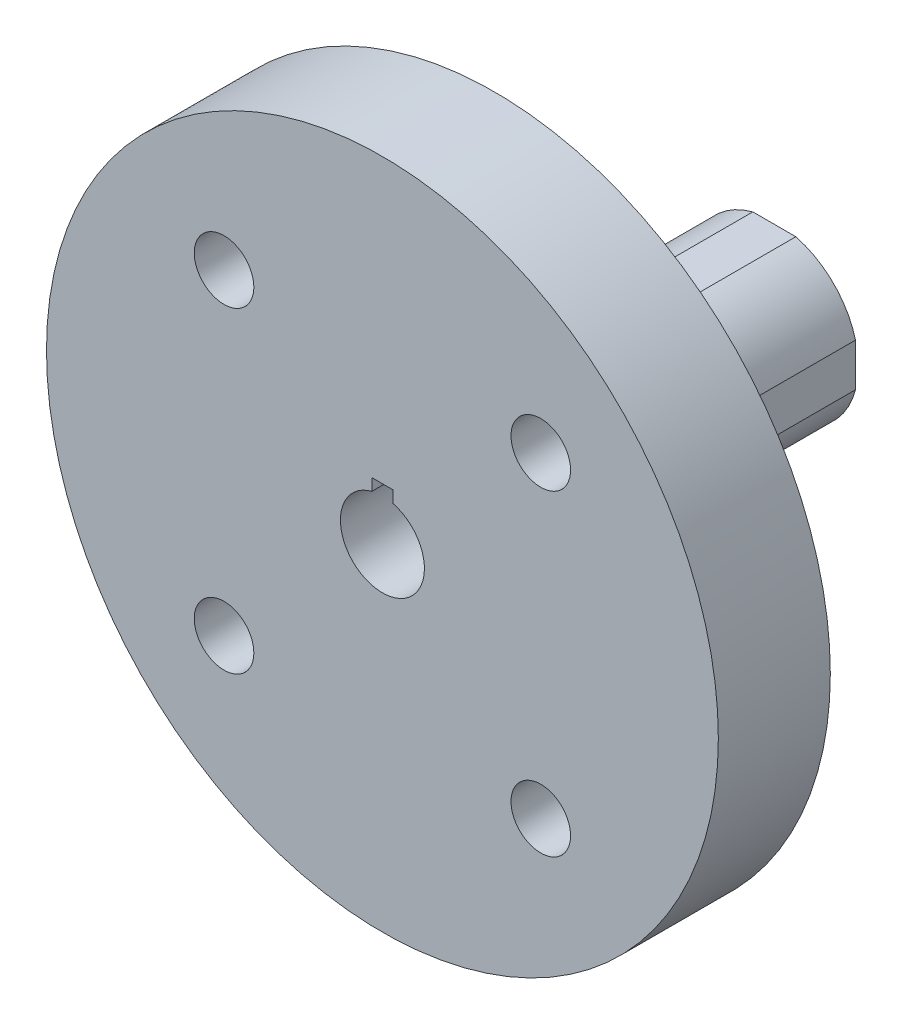
ISO-10303-21;
HEADER;
FILE_DESCRIPTION(('STEP AP214'),'2;1');
FILE_NAME('part.step','',(''),(''),'','','');
FILE_SCHEMA(('AUTOMOTIVE_DESIGN { 1 0 10303 214 1 1 1 1 }'));
ENDSEC;
DATA;
#1=APPLICATION_CONTEXT('core data for automotive mechanical design processes');
#2=APPLICATION_PROTOCOL_DEFINITION('international standard','automotive_design',2000,#1);
#3=PRODUCT_CONTEXT('',#1,'mechanical');
#4=PRODUCT('Part','Part','',(#3));
#5=PRODUCT_RELATED_PRODUCT_CATEGORY('part','',(#4));
#6=PRODUCT_DEFINITION_FORMATION('','',#4);
#7=PRODUCT_DEFINITION_CONTEXT('part definition',#1,'design');
#8=PRODUCT_DEFINITION('design','',#6,#7);
#9=PRODUCT_DEFINITION_SHAPE('','',#8);
#10=(LENGTH_UNIT() NAMED_UNIT(*) SI_UNIT(.MILLI.,.METRE.));
#11=(NAMED_UNIT(*) PLANE_ANGLE_UNIT() SI_UNIT($,.RADIAN.));
#12=(NAMED_UNIT(*) SI_UNIT($,.STERADIAN.) SOLID_ANGLE_UNIT());
#13=UNCERTAINTY_MEASURE_WITH_UNIT(LENGTH_MEASURE(1.E-05),#10,'distance_accuracy_value','');
#14=(GEOMETRIC_REPRESENTATION_CONTEXT(3) GLOBAL_UNCERTAINTY_ASSIGNED_CONTEXT((#13)) GLOBAL_UNIT_ASSIGNED_CONTEXT((#10,
#11,#12)) REPRESENTATION_CONTEXT('',''));
#15=CARTESIAN_POINT('',(0.,0.,0.));
#16=DIRECTION('',(0.,0.,1.));
#17=DIRECTION('',(1.,0.,0.));
#18=AXIS2_PLACEMENT_3D('',#15,#16,#17);
#19=CARTESIAN_POINT('',(0.,0.,0.));
#20=DIRECTION('',(0.,0.,1.));
#21=DIRECTION('',(1.,0.,0.));
#22=AXIS2_PLACEMENT_3D('',#19,#20,#21);
#23=PLANE('',#22);
#24=CARTESIAN_POINT('',(35.9210244842767,-35.9210244842765,0.));
#25=DIRECTION('',(0.,0.,1.));
#26=DIRECTION('',(1.,0.,0.));
#27=AXIS2_PLACEMENT_3D('',#24,#25,#26);
#28=CIRCLE('',#27,6.7564);
#29=CARTESIAN_POINT('',(42.6774244842767,-35.9210244842765,0.));
#30=VERTEX_POINT('',#29);
#31=EDGE_CURVE('E201',#30,#30,#28,.T.);
#32=ORIENTED_EDGE('',*,*,#31,.T.);
#33=EDGE_LOOP('',(#32));
#34=FACE_BOUND('',#33,.T.);
#35=CARTESIAN_POINT('',(-35.9210244842766,35.9210244842767,0.));
#36=DIRECTION('',(0.,0.,1.));
#37=DIRECTION('',(1.,0.,0.));
#38=AXIS2_PLACEMENT_3D('',#35,#36,#37);
#39=CIRCLE('',#38,6.7564);
#40=CARTESIAN_POINT('',(-29.1646244842766,35.9210244842767,0.));
#41=VERTEX_POINT('',#40);
#42=EDGE_CURVE('E463',#41,#41,#39,.T.);
#43=ORIENTED_EDGE('',*,*,#42,.T.);
#44=EDGE_LOOP('',(#43));
#45=FACE_BOUND('',#44,.T.);
#46=CARTESIAN_POINT('',(-35.9210244842767,-35.9210244842766,0.));
#47=DIRECTION('',(0.,0.,1.));
#48=DIRECTION('',(1.,0.,0.));
#49=AXIS2_PLACEMENT_3D('',#46,#47,#48);
#50=CIRCLE('',#49,6.7564);
#51=CARTESIAN_POINT('',(-29.1646244842767,-35.9210244842766,0.));
#52=VERTEX_POINT('',#51);
#53=EDGE_CURVE('E461',#52,#52,#50,.T.);
#54=ORIENTED_EDGE('',*,*,#53,.T.);
#55=EDGE_LOOP('',(#54));
#56=FACE_BOUND('',#55,.T.);
#57=CARTESIAN_POINT('',(35.9210244842765,35.9210244842767,0.));
#58=DIRECTION('',(0.,0.,1.));
#59=DIRECTION('',(1.,0.,0.));
#60=AXIS2_PLACEMENT_3D('',#57,#58,#59);
#61=CIRCLE('',#60,6.7564);
#62=CARTESIAN_POINT('',(42.6774244842765,35.9210244842767,0.));
#63=VERTEX_POINT('',#62);
#64=EDGE_CURVE('E464',#63,#63,#61,.T.);
#65=ORIENTED_EDGE('',*,*,#64,.T.);
#66=EDGE_LOOP('',(#65));
#67=FACE_BOUND('',#66,.T.);
#68=CARTESIAN_POINT('',(0.,0.,0.));
#69=DIRECTION('',(0.,0.,1.));
#70=DIRECTION('',(1.,0.,0.));
#71=AXIS2_PLACEMENT_3D('',#68,#69,#70);
#72=CIRCLE('',#71,76.2);
#73=CARTESIAN_POINT('',(76.2,0.,0.));
#74=VERTEX_POINT('',#73);
#75=EDGE_CURVE('E50',#74,#74,#72,.T.);
#76=ORIENTED_EDGE('',*,*,#75,.F.);
#77=EDGE_LOOP('',(#76));
#78=FACE_BOUND('',#77,.T.);
#79=DIRECTION('',(-1.,0.,0.));
#80=VECTOR('',#79,1.);
#81=CARTESIAN_POINT('',(50.165,-4.8775275498966,0.));
#82=LINE('',#81,#80);
#83=CARTESIAN_POINT('',(50.165,-4.8775275498966,0.));
#84=VERTEX_POINT('',#83);
#85=CARTESIAN_POINT('',(18.415,-4.8775275498966,0.));
#86=VERTEX_POINT('',#85);
#87=EDGE_CURVE('E197',#84,#86,#82,.T.);
#88=ORIENTED_EDGE('',*,*,#87,.F.);
#89=DIRECTION('',(0.,-1.,0.));
#90=VECTOR('',#89,1.);
#91=CARTESIAN_POINT('',(50.165,4.87752754989659,0.));
#92=LINE('',#91,#90);
#93=CARTESIAN_POINT('',(50.165,4.87752754989662,0.));
#94=VERTEX_POINT('',#93);
#95=EDGE_CURVE('E184',#94,#84,#92,.T.);
#96=ORIENTED_EDGE('',*,*,#95,.F.);
#97=DIRECTION('',(1.,0.,0.));
#98=VECTOR('',#97,1.);
#99=CARTESIAN_POINT('',(18.415,4.8775275498966,0.));
#100=LINE('',#99,#98);
#101=CARTESIAN_POINT('',(18.415,4.8775275498966,0.));
#102=VERTEX_POINT('',#101);
#103=EDGE_CURVE('E193',#102,#94,#100,.T.);
#104=ORIENTED_EDGE('',*,*,#103,.F.);
#105=CARTESIAN_POINT('',(0.,0.,0.));
#106=DIRECTION('',(0.,0.,-1.));
#107=DIRECTION('',(-1.,0.,0.));
#108=AXIS2_PLACEMENT_3D('',#105,#106,#107);
#109=CIRCLE('',#108,19.05);
#110=CARTESIAN_POINT('',(4.87752754989658,18.415,0.));
#111=VERTEX_POINT('',#110);
#112=EDGE_CURVE('E55',#111,#102,#109,.T.);
#113=ORIENTED_EDGE('',*,*,#112,.F.);
#114=DIRECTION('',(0.,-1.,0.));
#115=VECTOR('',#114,1.);
#116=CARTESIAN_POINT('',(4.87752754989658,18.415,0.));
#117=LINE('',#116,#115);
#118=CARTESIAN_POINT('',(4.87752754989658,50.165,0.));
#119=VERTEX_POINT('',#118);
#120=EDGE_CURVE('E281',#119,#111,#117,.T.);
#121=ORIENTED_EDGE('',*,*,#120,.F.);
#122=DIRECTION('',(1.,0.,0.));
#123=VECTOR('',#122,1.);
#124=CARTESIAN_POINT('',(-4.87752754989658,50.165,0.));
#125=LINE('',#124,#123);
#126=CARTESIAN_POINT('',(-4.87752754989658,50.165,0.));
#127=VERTEX_POINT('',#126);
#128=EDGE_CURVE('E284',#127,#119,#125,.T.);
#129=ORIENTED_EDGE('',*,*,#128,.F.);
#130=DIRECTION('',(0.,1.,0.));
#131=VECTOR('',#130,1.);
#132=CARTESIAN_POINT('',(-4.87752754989658,18.415,0.));
#133=LINE('',#132,#131);
#134=CARTESIAN_POINT('',(-4.87752754989658,18.415,0.));
#135=VERTEX_POINT('',#134);
#136=EDGE_CURVE('E277',#135,#127,#133,.T.);
#137=ORIENTED_EDGE('',*,*,#136,.F.);
#138=CARTESIAN_POINT('',(-18.415,4.87752754989656,0.));
#139=VERTEX_POINT('',#138);
#140=EDGE_CURVE('E11',#139,#135,#109,.T.);
#141=ORIENTED_EDGE('',*,*,#140,.F.);
#142=DIRECTION('',(1.,0.,0.));
#143=VECTOR('',#142,1.);
#144=CARTESIAN_POINT('',(-18.415,4.87752754989656,0.));
#145=LINE('',#144,#143);
#146=CARTESIAN_POINT('',(-50.165,4.87752754989656,0.));
#147=VERTEX_POINT('',#146);
#148=EDGE_CURVE('E220',#147,#139,#145,.T.);
#149=ORIENTED_EDGE('',*,*,#148,.F.);
#150=DIRECTION('',(0.,1.,0.));
#151=VECTOR('',#150,1.);
#152=CARTESIAN_POINT('',(-50.165,4.87752754989656,0.));
#153=LINE('',#152,#151);
#154=CARTESIAN_POINT('',(-50.165,-4.87752754989657,0.));
#155=VERTEX_POINT('',#154);
#156=EDGE_CURVE('E223',#155,#147,#153,.T.);
#157=ORIENTED_EDGE('',*,*,#156,.F.);
#158=DIRECTION('',(-1.,0.,0.));
#159=VECTOR('',#158,1.);
#160=CARTESIAN_POINT('',(-50.165,-4.87752754989656,0.));
#161=LINE('',#160,#159);
#162=CARTESIAN_POINT('',(-18.415,-4.87752754989656,0.));
#163=VERTEX_POINT('',#162);
#164=EDGE_CURVE('E216',#163,#155,#161,.T.);
#165=ORIENTED_EDGE('',*,*,#164,.F.);
#166=CARTESIAN_POINT('',(-4.8775275498954,-18.4150000000003,0.));
#167=VERTEX_POINT('',#166);
#168=EDGE_CURVE('E57',#167,#163,#109,.T.);
#169=ORIENTED_EDGE('',*,*,#168,.F.);
#170=DIRECTION('',(0.,1.,0.));
#171=VECTOR('',#170,1.);
#172=CARTESIAN_POINT('',(-4.8775275498954,-50.1650000000003,0.));
#173=LINE('',#172,#171);
#174=CARTESIAN_POINT('',(-4.8775275498954,-50.1650000000003,0.));
#175=VERTEX_POINT('',#174);
#176=EDGE_CURVE('E231',#175,#167,#173,.T.);
#177=ORIENTED_EDGE('',*,*,#176,.F.);
#178=DIRECTION('',(-1.,0.,0.));
#179=VECTOR('',#178,1.);
#180=CARTESIAN_POINT('',(4.8775275498954,-50.1650000000003,0.));
#181=LINE('',#180,#179);
#182=CARTESIAN_POINT('',(4.8775275498954,-50.1650000000003,0.));
#183=VERTEX_POINT('',#182);
#184=EDGE_CURVE('E235',#183,#175,#181,.T.);
#185=ORIENTED_EDGE('',*,*,#184,.F.);
#186=DIRECTION('',(0.,-1.,0.));
#187=VECTOR('',#186,1.);
#188=CARTESIAN_POINT('',(4.8775275498954,-18.4150000000003,0.));
#189=LINE('',#188,#187);
#190=CARTESIAN_POINT('',(4.8775275498954,-18.4150000000003,0.));
#191=VERTEX_POINT('',#190);
#192=EDGE_CURVE('E237',#191,#183,#189,.T.);
#193=ORIENTED_EDGE('',*,*,#192,.F.);
#194=EDGE_CURVE('E206',#86,#191,#109,.T.);
#195=ORIENTED_EDGE('',*,*,#194,.F.);
#196=EDGE_LOOP('',(#88,#96,#104,#113,#121,#129,#137,#141,#149,#157,#165,#169,#177,#185,#193,#195));
#197=FACE_BOUND('',#196,.T.);
#198=ADVANCED_FACE('F46',(#34,#45,#56,#67,#78,#197),#23,.F.);
#199=CARTESIAN_POINT('',(-18.415,4.87752754989656,0.));
#200=DIRECTION('',(1.,0.,0.));
#201=DIRECTION('',(0.,0.,-1.));
#202=AXIS2_PLACEMENT_3D('',#199,#200,#201);
#203=PLANE('',#202);
#204=DIRECTION('',(0.,-1.,0.));
#205=VECTOR('',#204,1.);
#206=CARTESIAN_POINT('',(-18.415,-4.87752754989656,-31.75));
#207=LINE('',#206,#205);
#208=CARTESIAN_POINT('',(-18.415,4.87752754989656,-31.75));
#209=VERTEX_POINT('',#208);
#210=CARTESIAN_POINT('',(-18.415,-4.87752754989657,-31.75));
#211=VERTEX_POINT('',#210);
#212=EDGE_CURVE('E217',#209,#211,#207,.T.);
#213=ORIENTED_EDGE('',*,*,#212,.F.);
#214=DIRECTION('',(0.,0.,-1.));
#215=VECTOR('',#214,1.);
#216=CARTESIAN_POINT('',(-18.415,4.87752754989656,0.));
#217=LINE('',#216,#215);
#218=CARTESIAN_POINT('',(-18.415,4.87752754989656,-63.5));
#219=VERTEX_POINT('',#218);
#220=EDGE_CURVE('E324',#209,#219,#217,.T.);
#221=ORIENTED_EDGE('',*,*,#220,.T.);
#222=DIRECTION('',(0.,-1.,0.));
#223=VECTOR('',#222,1.);
#224=CARTESIAN_POINT('',(-18.415,4.87752754989656,-63.5));
#225=LINE('',#224,#223);
#226=CARTESIAN_POINT('',(-18.415,-4.87752754989656,-63.5));
#227=VERTEX_POINT('',#226);
#228=EDGE_CURVE('E323',#219,#227,#225,.T.);
#229=ORIENTED_EDGE('',*,*,#228,.T.);
#230=DIRECTION('',(0.,0.,-1.));
#231=VECTOR('',#230,1.);
#232=CARTESIAN_POINT('',(-18.415,-4.87752754989656,0.));
#233=LINE('',#232,#231);
#234=EDGE_CURVE('E280',#211,#227,#233,.T.);
#235=ORIENTED_EDGE('',*,*,#234,.F.);
#236=EDGE_LOOP('',(#213,#221,#229,#235));
#237=FACE_BOUND('',#236,.T.);
#238=ADVANCED_FACE('F343',(#237),#203,.F.);
#239=CARTESIAN_POINT('',(4.87752754989658,18.415,0.));
#240=DIRECTION('',(0.,-1.,0.));
#241=DIRECTION('',(0.,0.,-1.));
#242=AXIS2_PLACEMENT_3D('',#239,#240,#241);
#243=PLANE('',#242);
#244=DIRECTION('',(-1.,0.,0.));
#245=VECTOR('',#244,1.);
#246=CARTESIAN_POINT('',(-4.87752754989658,18.415,-31.75));
#247=LINE('',#246,#245);
#248=CARTESIAN_POINT('',(4.87752754989658,18.415,-31.75));
#249=VERTEX_POINT('',#248);
#250=CARTESIAN_POINT('',(-4.87752754989658,18.415,-31.75));
#251=VERTEX_POINT('',#250);
#252=EDGE_CURVE('E278',#249,#251,#247,.T.);
#253=ORIENTED_EDGE('',*,*,#252,.F.);
#254=DIRECTION('',(0.,0.,-1.));
#255=VECTOR('',#254,1.);
#256=CARTESIAN_POINT('',(4.87752754989658,18.415,0.));
#257=LINE('',#256,#255);
#258=CARTESIAN_POINT('',(4.87752754989658,18.415,-63.5));
#259=VERTEX_POINT('',#258);
#260=EDGE_CURVE('E291',#249,#259,#257,.T.);
#261=ORIENTED_EDGE('',*,*,#260,.T.);
#262=DIRECTION('',(-1.,0.,0.));
#263=VECTOR('',#262,1.);
#264=CARTESIAN_POINT('',(4.87752754989658,18.415,-63.5));
#265=LINE('',#264,#263);
#266=CARTESIAN_POINT('',(-4.87752754989658,18.415,-63.5));
#267=VERTEX_POINT('',#266);
#268=EDGE_CURVE('E288',#259,#267,#265,.T.);
#269=ORIENTED_EDGE('',*,*,#268,.T.);
#270=DIRECTION('',(0.,0.,-1.));
#271=VECTOR('',#270,1.);
#272=CARTESIAN_POINT('',(-4.87752754989658,18.415,0.));
#273=LINE('',#272,#271);
#274=EDGE_CURVE('E297',#251,#267,#273,.T.);
#275=ORIENTED_EDGE('',*,*,#274,.F.);
#276=EDGE_LOOP('',(#253,#261,#269,#275));
#277=FACE_BOUND('',#276,.T.);
#278=ADVANCED_FACE('F348',(#277),#243,.F.);
#279=CARTESIAN_POINT('',(0.,0.,-63.5));
#280=DIRECTION('',(0.,0.,1.));
#281=DIRECTION('',(1.,0.,0.));
#282=AXIS2_PLACEMENT_3D('',#279,#280,#281);
#283=CYLINDRICAL_SURFACE('',#282,19.05);
#284=CARTESIAN_POINT('',(0.,0.,-63.5));
#285=DIRECTION('',(0.,0.,-1.));
#286=DIRECTION('',(-1.,0.,0.));
#287=AXIS2_PLACEMENT_3D('',#284,#285,#286);
#288=CIRCLE('',#287,19.05);
#289=CARTESIAN_POINT('',(18.415,4.8775275498966,-63.5));
#290=VERTEX_POINT('',#289);
#291=EDGE_CURVE('E332',#259,#290,#288,.T.);
#292=ORIENTED_EDGE('',*,*,#291,.F.);
#293=ORIENTED_EDGE('',*,*,#260,.F.);
#294=EDGE_CURVE('E298',#111,#249,#257,.T.);
#295=ORIENTED_EDGE('',*,*,#294,.F.);
#296=ORIENTED_EDGE('',*,*,#112,.T.);
#297=DIRECTION('',(0.,0.,-1.));
#298=VECTOR('',#297,1.);
#299=CARTESIAN_POINT('',(18.415,4.8775275498966,0.));
#300=LINE('',#299,#298);
#301=CARTESIAN_POINT('',(18.415,4.87752754989662,-31.75));
#302=VERTEX_POINT('',#301);
#303=EDGE_CURVE('E303',#102,#302,#300,.T.);
#304=ORIENTED_EDGE('',*,*,#303,.T.);
#305=EDGE_CURVE('E306',#302,#290,#300,.T.);
#306=ORIENTED_EDGE('',*,*,#305,.T.);
#307=EDGE_LOOP('',(#292,#293,#295,#296,#304,#306));
#308=FACE_BOUND('',#307,.T.);
#309=ADVANCED_FACE('F363',(#308),#283,.T.);
#310=CARTESIAN_POINT('',(18.415,-4.87752754989659,-63.5));
#311=VERTEX_POINT('',#310);
#312=CARTESIAN_POINT('',(4.8775275498954,-18.4150000000003,-63.5));
#313=VERTEX_POINT('',#312);
#314=EDGE_CURVE('E509',#311,#313,#288,.T.);
#315=ORIENTED_EDGE('',*,*,#314,.F.);
#316=DIRECTION('',(0.,0.,-1.));
#317=VECTOR('',#316,1.);
#318=CARTESIAN_POINT('',(18.415,-4.8775275498966,0.));
#319=LINE('',#318,#317);
#320=CARTESIAN_POINT('',(18.415,-4.8775275498966,-31.75));
#321=VERTEX_POINT('',#320);
#322=EDGE_CURVE('E302',#321,#311,#319,.T.);
#323=ORIENTED_EDGE('',*,*,#322,.F.);
#324=EDGE_CURVE('E199',#86,#321,#319,.T.);
#325=ORIENTED_EDGE('',*,*,#324,.F.);
#326=ORIENTED_EDGE('',*,*,#194,.T.);
#327=DIRECTION('',(0.,0.,-1.));
#328=VECTOR('',#327,1.);
#329=CARTESIAN_POINT('',(4.8775275498954,-18.4150000000003,0.));
#330=LINE('',#329,#328);
#331=CARTESIAN_POINT('',(4.8775275498954,-18.4150000000003,-31.75));
#332=VERTEX_POINT('',#331);
#333=EDGE_CURVE('E314',#191,#332,#330,.T.);
#334=ORIENTED_EDGE('',*,*,#333,.T.);
#335=EDGE_CURVE('E317',#332,#313,#330,.T.);
#336=ORIENTED_EDGE('',*,*,#335,.T.);
#337=EDGE_LOOP('',(#315,#323,#325,#326,#334,#336));
#338=FACE_BOUND('',#337,.T.);
#339=ADVANCED_FACE('F532',(#338),#283,.T.);
#340=CARTESIAN_POINT('',(-4.8775275498954,-18.4150000000003,-63.5));
#341=VERTEX_POINT('',#340);
#342=EDGE_CURVE('E296',#341,#227,#288,.T.);
#343=ORIENTED_EDGE('',*,*,#342,.F.);
#344=DIRECTION('',(0.,0.,-1.));
#345=VECTOR('',#344,1.);
#346=CARTESIAN_POINT('',(-4.8775275498954,-18.4150000000003,0.));
#347=LINE('',#346,#345);
#348=CARTESIAN_POINT('',(-4.8775275498954,-18.4150000000003,-31.75));
#349=VERTEX_POINT('',#348);
#350=EDGE_CURVE('E313',#349,#341,#347,.T.);
#351=ORIENTED_EDGE('',*,*,#350,.F.);
#352=EDGE_CURVE('E309',#167,#349,#347,.T.);
#353=ORIENTED_EDGE('',*,*,#352,.F.);
#354=ORIENTED_EDGE('',*,*,#168,.T.);
#355=EDGE_CURVE('E325',#163,#211,#233,.T.);
#356=ORIENTED_EDGE('',*,*,#355,.T.);
#357=ORIENTED_EDGE('',*,*,#234,.T.);
#358=EDGE_LOOP('',(#343,#351,#353,#354,#356,#357));
#359=FACE_BOUND('',#358,.T.);
#360=ADVANCED_FACE('F364',(#359),#283,.T.);
#361=CARTESIAN_POINT('',(0.,0.,25.4));
#362=DIRECTION('',(0.,0.,-1.));
#363=DIRECTION('',(-1.,0.,0.));
#364=AXIS2_PLACEMENT_3D('',#361,#362,#363);
#365=CYLINDRICAL_SURFACE('',#364,76.2);
#366=CARTESIAN_POINT('',(0.,0.,25.4));
#367=DIRECTION('',(0.,0.,1.));
#368=DIRECTION('',(1.,0.,0.));
#369=AXIS2_PLACEMENT_3D('',#366,#367,#368);
#370=CIRCLE('',#369,76.2);
#371=CARTESIAN_POINT('',(76.2,0.,25.4));
#372=VERTEX_POINT('',#371);
#373=EDGE_CURVE('E333',#372,#372,#370,.T.);
#374=ORIENTED_EDGE('',*,*,#373,.F.);
#375=EDGE_LOOP('',(#374));
#376=FACE_BOUND('',#375,.T.);
#377=ORIENTED_EDGE('',*,*,#75,.T.);
#378=EDGE_LOOP('',(#377));
#379=FACE_BOUND('',#378,.T.);
#380=ADVANCED_FACE('F48',(#376,#379),#365,.T.);
#381=CARTESIAN_POINT('',(0.,0.,25.4));
#382=DIRECTION('',(0.,0.,1.));
#383=DIRECTION('',(1.,0.,0.));
#384=AXIS2_PLACEMENT_3D('',#381,#382,#383);
#385=PLANE('',#384);
#386=CARTESIAN_POINT('',(35.9210244842767,-35.9210244842765,25.4));
#387=DIRECTION('',(0.,0.,1.));
#388=DIRECTION('',(1.,0.,0.));
#389=AXIS2_PLACEMENT_3D('',#386,#387,#388);
#390=CIRCLE('',#389,6.7564);
#391=CARTESIAN_POINT('',(42.6774244842767,-35.9210244842765,25.4));
#392=VERTEX_POINT('',#391);
#393=EDGE_CURVE('E477',#392,#392,#390,.T.);
#394=ORIENTED_EDGE('',*,*,#393,.F.);
#395=EDGE_LOOP('',(#394));
#396=FACE_BOUND('',#395,.T.);
#397=CARTESIAN_POINT('',(-35.9210244842766,35.9210244842767,25.4));
#398=DIRECTION('',(0.,0.,1.));
#399=DIRECTION('',(1.,0.,0.));
#400=AXIS2_PLACEMENT_3D('',#397,#398,#399);
#401=CIRCLE('',#400,6.7564);
#402=CARTESIAN_POINT('',(-29.1646244842766,35.9210244842767,25.4));
#403=VERTEX_POINT('',#402);
#404=EDGE_CURVE('E480',#403,#403,#401,.T.);
#405=ORIENTED_EDGE('',*,*,#404,.F.);
#406=EDGE_LOOP('',(#405));
#407=FACE_BOUND('',#406,.T.);
#408=CARTESIAN_POINT('',(-35.9210244842767,-35.9210244842766,25.4));
#409=DIRECTION('',(0.,0.,1.));
#410=DIRECTION('',(1.,0.,0.));
#411=AXIS2_PLACEMENT_3D('',#408,#409,#410);
#412=CIRCLE('',#411,6.7564);
#413=CARTESIAN_POINT('',(-29.1646244842767,-35.9210244842766,25.4));
#414=VERTEX_POINT('',#413);
#415=EDGE_CURVE('E458',#414,#414,#412,.T.);
#416=ORIENTED_EDGE('',*,*,#415,.F.);
#417=EDGE_LOOP('',(#416));
#418=FACE_BOUND('',#417,.T.);
#419=CARTESIAN_POINT('',(35.9210244842765,35.9210244842767,25.4));
#420=DIRECTION('',(0.,0.,1.));
#421=DIRECTION('',(1.,0.,0.));
#422=AXIS2_PLACEMENT_3D('',#419,#420,#421);
#423=CIRCLE('',#422,6.7564);
#424=CARTESIAN_POINT('',(42.6774244842765,35.9210244842767,25.4));
#425=VERTEX_POINT('',#424);
#426=EDGE_CURVE('E469',#425,#425,#423,.T.);
#427=ORIENTED_EDGE('',*,*,#426,.F.);
#428=EDGE_LOOP('',(#427));
#429=FACE_BOUND('',#428,.T.);
#430=DIRECTION('',(0.,1.,0.));
#431=VECTOR('',#430,1.);
#432=CARTESIAN_POINT('',(2.38125,11.90625,25.4));
#433=LINE('',#432,#431);
#434=CARTESIAN_POINT('',(2.38125,9.22254159315641,25.4));
#435=VERTEX_POINT('',#434);
#436=CARTESIAN_POINT('',(2.38125,11.90625,25.4));
#437=VERTEX_POINT('',#436);
#438=EDGE_CURVE('E245',#435,#437,#433,.T.);
#439=ORIENTED_EDGE('',*,*,#438,.F.);
#440=CARTESIAN_POINT('',(0.,0.,25.4));
#441=DIRECTION('',(0.,0.,1.));
#442=DIRECTION('',(1.,0.,0.));
#443=AXIS2_PLACEMENT_3D('',#440,#441,#442);
#444=CIRCLE('',#443,9.525);
#445=CARTESIAN_POINT('',(-2.38125,9.22254159315641,25.4));
#446=VERTEX_POINT('',#445);
#447=EDGE_CURVE('E260',#446,#435,#444,.T.);
#448=ORIENTED_EDGE('',*,*,#447,.F.);
#449=DIRECTION('',(0.,-1.,0.));
#450=VECTOR('',#449,1.);
#451=CARTESIAN_POINT('',(-2.38125,11.90625,25.4));
#452=LINE('',#451,#450);
#453=CARTESIAN_POINT('',(-2.38125,11.90625,25.4));
#454=VERTEX_POINT('',#453);
#455=EDGE_CURVE('E254',#454,#446,#452,.T.);
#456=ORIENTED_EDGE('',*,*,#455,.F.);
#457=DIRECTION('',(-1.,0.,0.));
#458=VECTOR('',#457,1.);
#459=CARTESIAN_POINT('',(-2.38125,11.90625,25.4));
#460=LINE('',#459,#458);
#461=EDGE_CURVE('E234',#437,#454,#460,.T.);
#462=ORIENTED_EDGE('',*,*,#461,.F.);
#463=EDGE_LOOP('',(#439,#448,#456,#462));
#464=FACE_BOUND('',#463,.T.);
#465=ORIENTED_EDGE('',*,*,#373,.T.);
#466=EDGE_LOOP('',(#465));
#467=FACE_BOUND('',#466,.T.);
#468=ADVANCED_FACE('F354',(#396,#407,#418,#429,#464,#467),#385,.T.);
#469=ORIENTED_EDGE('',*,*,#140,.T.);
#470=EDGE_CURVE('E293',#135,#251,#273,.T.);
#471=ORIENTED_EDGE('',*,*,#470,.T.);
#472=ORIENTED_EDGE('',*,*,#274,.T.);
#473=EDGE_CURVE('E330',#219,#267,#288,.T.);
#474=ORIENTED_EDGE('',*,*,#473,.F.);
#475=ORIENTED_EDGE('',*,*,#220,.F.);
#476=EDGE_CURVE('E320',#139,#209,#217,.T.);
#477=ORIENTED_EDGE('',*,*,#476,.F.);
#478=EDGE_LOOP('',(#469,#471,#472,#474,#475,#477));
#479=FACE_BOUND('',#478,.T.);
#480=ADVANCED_FACE('F357',(#479),#283,.T.);
#481=CARTESIAN_POINT('',(0.,0.,-63.5));
#482=DIRECTION('',(0.,0.,-1.));
#483=DIRECTION('',(-1.,0.,0.));
#484=AXIS2_PLACEMENT_3D('',#481,#482,#483);
#485=PLANE('',#484);
#486=DIRECTION('',(0.,1.,0.));
#487=VECTOR('',#486,1.);
#488=CARTESIAN_POINT('',(2.38125,11.90625,-63.5));
#489=LINE('',#488,#487);
#490=CARTESIAN_POINT('',(2.38125,9.22254159315641,-63.5));
#491=VERTEX_POINT('',#490);
#492=CARTESIAN_POINT('',(2.38125,11.90625,-63.5));
#493=VERTEX_POINT('',#492);
#494=EDGE_CURVE('E248',#491,#493,#489,.T.);
#495=ORIENTED_EDGE('',*,*,#494,.T.);
#496=DIRECTION('',(-1.,0.,0.));
#497=VECTOR('',#496,1.);
#498=CARTESIAN_POINT('',(-2.38125,11.90625,-63.5));
#499=LINE('',#498,#497);
#500=CARTESIAN_POINT('',(-2.38125,11.90625,-63.5));
#501=VERTEX_POINT('',#500);
#502=EDGE_CURVE('E241',#493,#501,#499,.T.);
#503=ORIENTED_EDGE('',*,*,#502,.T.);
#504=DIRECTION('',(0.,-1.,0.));
#505=VECTOR('',#504,1.);
#506=CARTESIAN_POINT('',(-2.38125,11.90625,-63.5));
#507=LINE('',#506,#505);
#508=CARTESIAN_POINT('',(-2.38125,9.22254159315641,-63.5));
#509=VERTEX_POINT('',#508);
#510=EDGE_CURVE('E244',#501,#509,#507,.T.);
#511=ORIENTED_EDGE('',*,*,#510,.T.);
#512=CARTESIAN_POINT('',(0.,0.,-63.5));
#513=DIRECTION('',(0.,0.,1.));
#514=DIRECTION('',(1.,0.,0.));
#515=AXIS2_PLACEMENT_3D('',#512,#513,#514);
#516=CIRCLE('',#515,9.525);
#517=EDGE_CURVE('E267',#509,#491,#516,.T.);
#518=ORIENTED_EDGE('',*,*,#517,.T.);
#519=EDGE_LOOP('',(#495,#503,#511,#518));
#520=FACE_BOUND('',#519,.T.);
#521=ORIENTED_EDGE('',*,*,#268,.F.);
#522=ORIENTED_EDGE('',*,*,#291,.T.);
#523=DIRECTION('',(0.,1.,0.));
#524=VECTOR('',#523,1.);
#525=CARTESIAN_POINT('',(18.415,4.8775275498966,-63.5));
#526=LINE('',#525,#524);
#527=EDGE_CURVE('E292',#311,#290,#526,.T.);
#528=ORIENTED_EDGE('',*,*,#527,.F.);
#529=ORIENTED_EDGE('',*,*,#314,.T.);
#530=DIRECTION('',(1.,0.,0.));
#531=VECTOR('',#530,1.);
#532=CARTESIAN_POINT('',(-4.8775275498954,-18.4150000000003,-63.5));
#533=LINE('',#532,#531);
#534=EDGE_CURVE('E312',#341,#313,#533,.T.);
#535=ORIENTED_EDGE('',*,*,#534,.F.);
#536=ORIENTED_EDGE('',*,*,#342,.T.);
#537=ORIENTED_EDGE('',*,*,#228,.F.);
#538=ORIENTED_EDGE('',*,*,#473,.T.);
#539=EDGE_LOOP('',(#521,#522,#528,#529,#535,#536,#537,#538));
#540=FACE_BOUND('',#539,.T.);
#541=ADVANCED_FACE('F361',(#520,#540),#485,.T.);
#542=CARTESIAN_POINT('',(-4.8775275498954,-18.4150000000003,0.));
#543=DIRECTION('',(0.,1.,0.));
#544=DIRECTION('',(0.,0.,1.));
#545=AXIS2_PLACEMENT_3D('',#542,#543,#544);
#546=PLANE('',#545);
#547=ORIENTED_EDGE('',*,*,#335,.F.);
#548=DIRECTION('',(1.,0.,0.));
#549=VECTOR('',#548,1.);
#550=CARTESIAN_POINT('',(-4.8775275498954,-18.4150000000003,-31.75));
#551=LINE('',#550,#549);
#552=EDGE_CURVE('E232',#349,#332,#551,.T.);
#553=ORIENTED_EDGE('',*,*,#552,.F.);
#554=ORIENTED_EDGE('',*,*,#350,.T.);
#555=ORIENTED_EDGE('',*,*,#534,.T.);
#556=EDGE_LOOP('',(#547,#553,#554,#555));
#557=FACE_BOUND('',#556,.T.);
#558=ADVANCED_FACE('F366',(#557),#546,.F.);
#559=CARTESIAN_POINT('',(18.415,4.8775275498966,0.));
#560=DIRECTION('',(-1.,0.,0.));
#561=DIRECTION('',(0.,0.,1.));
#562=AXIS2_PLACEMENT_3D('',#559,#560,#561);
#563=PLANE('',#562);
#564=ORIENTED_EDGE('',*,*,#305,.F.);
#565=DIRECTION('',(0.,1.,0.));
#566=VECTOR('',#565,1.);
#567=CARTESIAN_POINT('',(18.415,-4.8775275498966,-31.75));
#568=LINE('',#567,#566);
#569=EDGE_CURVE('E192',#321,#302,#568,.T.);
#570=ORIENTED_EDGE('',*,*,#569,.F.);
#571=ORIENTED_EDGE('',*,*,#322,.T.);
#572=ORIENTED_EDGE('',*,*,#527,.T.);
#573=EDGE_LOOP('',(#564,#570,#571,#572));
#574=FACE_BOUND('',#573,.T.);
#575=ADVANCED_FACE('F371',(#574),#563,.F.);
#576=CARTESIAN_POINT('',(-4.87752754989658,18.415,-31.75));
#577=DIRECTION('',(1.,0.,0.));
#578=DIRECTION('',(0.,0.,-1.));
#579=AXIS2_PLACEMENT_3D('',#576,#577,#578);
#580=PLANE('',#579);
#581=ORIENTED_EDGE('',*,*,#136,.T.);
#582=DIRECTION('',(0.,-0.707106781186548,-0.707106781186548));
#583=VECTOR('',#582,1.);
#584=CARTESIAN_POINT('',(-4.87752754989658,18.415,-31.75));
#585=LINE('',#584,#583);
#586=EDGE_CURVE('E274',#127,#251,#585,.T.);
#587=ORIENTED_EDGE('',*,*,#586,.T.);
#588=ORIENTED_EDGE('',*,*,#470,.F.);
#589=EDGE_LOOP('',(#581,#587,#588));
#590=FACE_BOUND('',#589,.T.);
#591=ADVANCED_FACE('F375',(#590),#580,.F.);
#592=CARTESIAN_POINT('',(4.87752754989658,18.415,-31.75));
#593=DIRECTION('',(-1.,0.,0.));
#594=DIRECTION('',(0.,0.,1.));
#595=AXIS2_PLACEMENT_3D('',#592,#593,#594);
#596=PLANE('',#595);
#597=ORIENTED_EDGE('',*,*,#294,.T.);
#598=DIRECTION('',(0.,-0.707106781186548,-0.707106781186548));
#599=VECTOR('',#598,1.);
#600=CARTESIAN_POINT('',(4.87752754989658,18.415,-31.75));
#601=LINE('',#600,#599);
#602=EDGE_CURVE('E270',#119,#249,#601,.T.);
#603=ORIENTED_EDGE('',*,*,#602,.F.);
#604=ORIENTED_EDGE('',*,*,#120,.T.);
#605=EDGE_LOOP('',(#597,#603,#604));
#606=FACE_BOUND('',#605,.T.);
#607=ADVANCED_FACE('F382',(#606),#596,.F.);
#608=CARTESIAN_POINT('',(-26.8724724501034,18.415,-31.75));
#609=DIRECTION('',(0.,-0.707106781186548,0.707106781186548));
#610=DIRECTION('',(0.,-0.707106781186548,-0.707106781186548));
#611=AXIS2_PLACEMENT_3D('',#608,#609,#610);
#612=PLANE('',#611);
#613=ORIENTED_EDGE('',*,*,#128,.T.);
#614=ORIENTED_EDGE('',*,*,#602,.T.);
#615=ORIENTED_EDGE('',*,*,#252,.T.);
#616=ORIENTED_EDGE('',*,*,#586,.F.);
#617=EDGE_LOOP('',(#613,#614,#615,#616));
#618=FACE_BOUND('',#617,.T.);
#619=ADVANCED_FACE('F386',(#618),#612,.F.);
#620=CARTESIAN_POINT('',(0.,0.,-63.5));
#621=DIRECTION('',(0.,0.,1.));
#622=DIRECTION('',(1.,0.,0.));
#623=AXIS2_PLACEMENT_3D('',#620,#621,#622);
#624=CYLINDRICAL_SURFACE('',#623,9.525);
#625=ORIENTED_EDGE('',*,*,#447,.T.);
#626=DIRECTION('',(0.,0.,1.));
#627=VECTOR('',#626,1.);
#628=CARTESIAN_POINT('',(2.38125,9.22254159315641,-63.5));
#629=LINE('',#628,#627);
#630=EDGE_CURVE('E261',#491,#435,#629,.T.);
#631=ORIENTED_EDGE('',*,*,#630,.F.);
#632=ORIENTED_EDGE('',*,*,#517,.F.);
#633=DIRECTION('',(0.,0.,1.));
#634=VECTOR('',#633,1.);
#635=CARTESIAN_POINT('',(-2.38125,9.22254159315641,-63.5));
#636=LINE('',#635,#634);
#637=EDGE_CURVE('E263',#509,#446,#636,.T.);
#638=ORIENTED_EDGE('',*,*,#637,.T.);
#639=EDGE_LOOP('',(#625,#631,#632,#638));
#640=FACE_BOUND('',#639,.T.);
#641=ADVANCED_FACE('F390',(#640),#624,.F.);
#642=CARTESIAN_POINT('',(-2.38125,11.90625,-63.5));
#643=DIRECTION('',(0.,1.,0.));
#644=DIRECTION('',(0.,0.,1.));
#645=AXIS2_PLACEMENT_3D('',#642,#643,#644);
#646=PLANE('',#645);
#647=ORIENTED_EDGE('',*,*,#461,.T.);
#648=DIRECTION('',(0.,0.,1.));
#649=VECTOR('',#648,1.);
#650=CARTESIAN_POINT('',(-2.38125,11.90625,-63.5));
#651=LINE('',#650,#649);
#652=EDGE_CURVE('E251',#501,#454,#651,.T.);
#653=ORIENTED_EDGE('',*,*,#652,.F.);
#654=ORIENTED_EDGE('',*,*,#502,.F.);
#655=DIRECTION('',(0.,0.,1.));
#656=VECTOR('',#655,1.);
#657=CARTESIAN_POINT('',(2.38125,11.90625,-63.5));
#658=LINE('',#657,#656);
#659=EDGE_CURVE('E258',#493,#437,#658,.T.);
#660=ORIENTED_EDGE('',*,*,#659,.T.);
#661=EDGE_LOOP('',(#647,#653,#654,#660));
#662=FACE_BOUND('',#661,.T.);
#663=ADVANCED_FACE('F394',(#662),#646,.F.);
#664=CARTESIAN_POINT('',(2.38125,11.90625,-63.5));
#665=DIRECTION('',(1.,0.,0.));
#666=DIRECTION('',(0.,0.,-1.));
#667=AXIS2_PLACEMENT_3D('',#664,#665,#666);
#668=PLANE('',#667);
#669=ORIENTED_EDGE('',*,*,#438,.T.);
#670=ORIENTED_EDGE('',*,*,#659,.F.);
#671=ORIENTED_EDGE('',*,*,#494,.F.);
#672=ORIENTED_EDGE('',*,*,#630,.T.);
#673=EDGE_LOOP('',(#669,#670,#671,#672));
#674=FACE_BOUND('',#673,.T.);
#675=ADVANCED_FACE('F398',(#674),#668,.F.);
#676=CARTESIAN_POINT('',(-2.38125,11.90625,-63.5));
#677=DIRECTION('',(-1.,0.,0.));
#678=DIRECTION('',(0.,0.,1.));
#679=AXIS2_PLACEMENT_3D('',#676,#677,#678);
#680=PLANE('',#679);
#681=ORIENTED_EDGE('',*,*,#455,.T.);
#682=ORIENTED_EDGE('',*,*,#637,.F.);
#683=ORIENTED_EDGE('',*,*,#510,.F.);
#684=ORIENTED_EDGE('',*,*,#652,.T.);
#685=EDGE_LOOP('',(#681,#682,#683,#684));
#686=FACE_BOUND('',#685,.T.);
#687=ADVANCED_FACE('F400',(#686),#680,.F.);
#688=CARTESIAN_POINT('',(-4.8775275498954,-50.1650000000003,-31.75));
#689=DIRECTION('',(1.,0.,0.));
#690=DIRECTION('',(0.,0.,-1.));
#691=AXIS2_PLACEMENT_3D('',#688,#689,#690);
#692=PLANE('',#691);
#693=ORIENTED_EDGE('',*,*,#352,.T.);
#694=DIRECTION('',(0.,0.707106781186548,-0.707106781186548));
#695=VECTOR('',#694,1.);
#696=CARTESIAN_POINT('',(-4.8775275498954,-18.4150000000003,-31.75));
#697=LINE('',#696,#695);
#698=EDGE_CURVE('E219',#175,#349,#697,.T.);
#699=ORIENTED_EDGE('',*,*,#698,.F.);
#700=ORIENTED_EDGE('',*,*,#176,.T.);
#701=EDGE_LOOP('',(#693,#699,#700));
#702=FACE_BOUND('',#701,.T.);
#703=ADVANCED_FACE('F403',(#702),#692,.F.);
#704=CARTESIAN_POINT('',(4.8775275498954,-18.4150000000003,-31.75));
#705=DIRECTION('',(-1.,0.,0.));
#706=DIRECTION('',(0.,-1.,0.));
#707=AXIS2_PLACEMENT_3D('',#704,#705,#706);
#708=PLANE('',#707);
#709=ORIENTED_EDGE('',*,*,#192,.T.);
#710=DIRECTION('',(0.,0.707106781186548,-0.707106781186548));
#711=VECTOR('',#710,1.);
#712=CARTESIAN_POINT('',(4.8775275498954,-18.4150000000003,-31.75));
#713=LINE('',#712,#711);
#714=EDGE_CURVE('E228',#183,#332,#713,.T.);
#715=ORIENTED_EDGE('',*,*,#714,.T.);
#716=ORIENTED_EDGE('',*,*,#333,.F.);
#717=EDGE_LOOP('',(#709,#715,#716));
#718=FACE_BOUND('',#717,.T.);
#719=ADVANCED_FACE('F410',(#718),#708,.F.);
#720=CARTESIAN_POINT('',(76.2,-18.4150000000003,-31.75));
#721=DIRECTION('',(0.,0.707106781186547,0.707106781186547));
#722=DIRECTION('',(0.,-0.707106781186548,0.707106781186548));
#723=AXIS2_PLACEMENT_3D('',#720,#721,#722);
#724=PLANE('',#723);
#725=ORIENTED_EDGE('',*,*,#184,.T.);
#726=ORIENTED_EDGE('',*,*,#698,.T.);
#727=ORIENTED_EDGE('',*,*,#552,.T.);
#728=ORIENTED_EDGE('',*,*,#714,.F.);
#729=EDGE_LOOP('',(#725,#726,#727,#728));
#730=FACE_BOUND('',#729,.T.);
#731=ADVANCED_FACE('F414',(#730),#724,.F.);
#732=CARTESIAN_POINT('',(-50.165,-4.87752754989656,-31.75));
#733=DIRECTION('',(0.,1.,0.));
#734=DIRECTION('',(-1.,0.,0.));
#735=AXIS2_PLACEMENT_3D('',#732,#733,#734);
#736=PLANE('',#735);
#737=ORIENTED_EDGE('',*,*,#164,.T.);
#738=DIRECTION('',(0.707106781186548,0.,-0.707106781186548));
#739=VECTOR('',#738,1.);
#740=CARTESIAN_POINT('',(-34.29,-4.87752754989656,-15.875));
#741=LINE('',#740,#739);
#742=EDGE_CURVE('E213',#155,#211,#741,.T.);
#743=ORIENTED_EDGE('',*,*,#742,.T.);
#744=ORIENTED_EDGE('',*,*,#355,.F.);
#745=EDGE_LOOP('',(#737,#743,#744));
#746=FACE_BOUND('',#745,.T.);
#747=ADVANCED_FACE('F418',(#746),#736,.F.);
#748=CARTESIAN_POINT('',(-18.415,4.87752754989656,-31.75));
#749=DIRECTION('',(0.,-1.,0.));
#750=DIRECTION('',(0.,0.,-1.));
#751=AXIS2_PLACEMENT_3D('',#748,#749,#750);
#752=PLANE('',#751);
#753=ORIENTED_EDGE('',*,*,#476,.T.);
#754=DIRECTION('',(0.707106781186548,0.,-0.707106781186548));
#755=VECTOR('',#754,1.);
#756=CARTESIAN_POINT('',(-18.415,4.87752754989656,-31.75));
#757=LINE('',#756,#755);
#758=EDGE_CURVE('E72',#147,#209,#757,.T.);
#759=ORIENTED_EDGE('',*,*,#758,.F.);
#760=ORIENTED_EDGE('',*,*,#148,.T.);
#761=EDGE_LOOP('',(#753,#759,#760));
#762=FACE_BOUND('',#761,.T.);
#763=ADVANCED_FACE('F422',(#762),#752,.F.);
#764=CARTESIAN_POINT('',(-18.415,-76.2,-31.75));
#765=DIRECTION('',(0.707106781186548,0.,0.707106781186548));
#766=DIRECTION('',(0.707106781186548,0.,-0.707106781186548));
#767=AXIS2_PLACEMENT_3D('',#764,#765,#766);
#768=PLANE('',#767);
#769=ORIENTED_EDGE('',*,*,#156,.T.);
#770=ORIENTED_EDGE('',*,*,#758,.T.);
#771=ORIENTED_EDGE('',*,*,#212,.T.);
#772=ORIENTED_EDGE('',*,*,#742,.F.);
#773=EDGE_LOOP('',(#769,#770,#771,#772));
#774=FACE_BOUND('',#773,.T.);
#775=ADVANCED_FACE('F426',(#774),#768,.F.);
#776=CARTESIAN_POINT('',(50.165,-4.8775275498966,-31.75));
#777=DIRECTION('',(0.,1.,0.));
#778=DIRECTION('',(0.,0.,1.));
#779=AXIS2_PLACEMENT_3D('',#776,#777,#778);
#780=PLANE('',#779);
#781=ORIENTED_EDGE('',*,*,#324,.T.);
#782=DIRECTION('',(-0.707106781186548,0.,-0.707106781186548));
#783=VECTOR('',#782,1.);
#784=CARTESIAN_POINT('',(18.415,-4.8775275498966,-31.75));
#785=LINE('',#784,#783);
#786=EDGE_CURVE('E64',#84,#321,#785,.T.);
#787=ORIENTED_EDGE('',*,*,#786,.F.);
#788=ORIENTED_EDGE('',*,*,#87,.T.);
#789=EDGE_LOOP('',(#781,#787,#788));
#790=FACE_BOUND('',#789,.T.);
#791=ADVANCED_FACE('F196',(#790),#780,.F.);
#792=CARTESIAN_POINT('',(18.415,4.8775275498966,-31.75));
#793=DIRECTION('',(0.,-1.,0.));
#794=DIRECTION('',(1.,0.,0.));
#795=AXIS2_PLACEMENT_3D('',#792,#793,#794);
#796=PLANE('',#795);
#797=ORIENTED_EDGE('',*,*,#103,.T.);
#798=DIRECTION('',(-0.707106781186548,0.,-0.707106781186548));
#799=VECTOR('',#798,1.);
#800=CARTESIAN_POINT('',(18.415,4.8775275498966,-31.75));
#801=LINE('',#800,#799);
#802=EDGE_CURVE('E187',#94,#302,#801,.T.);
#803=ORIENTED_EDGE('',*,*,#802,.T.);
#804=ORIENTED_EDGE('',*,*,#303,.F.);
#805=EDGE_LOOP('',(#797,#803,#804));
#806=FACE_BOUND('',#805,.T.);
#807=ADVANCED_FACE('F432',(#806),#796,.F.);
#808=CARTESIAN_POINT('',(18.415,76.2,-31.75));
#809=DIRECTION('',(-0.707106781186547,0.,0.707106781186547));
#810=DIRECTION('',(0.707106781186548,0.,0.707106781186548));
#811=AXIS2_PLACEMENT_3D('',#808,#809,#810);
#812=PLANE('',#811);
#813=ORIENTED_EDGE('',*,*,#95,.T.);
#814=ORIENTED_EDGE('',*,*,#786,.T.);
#815=ORIENTED_EDGE('',*,*,#569,.T.);
#816=ORIENTED_EDGE('',*,*,#802,.F.);
#817=EDGE_LOOP('',(#813,#814,#815,#816));
#818=FACE_BOUND('',#817,.T.);
#819=ADVANCED_FACE('F185',(#818),#812,.F.);
#820=CARTESIAN_POINT('',(35.9210244842765,35.9210244842767,-63.5));
#821=DIRECTION('',(0.,0.,1.));
#822=DIRECTION('',(1.,0.,0.));
#823=AXIS2_PLACEMENT_3D('',#820,#821,#822);
#824=CYLINDRICAL_SURFACE('',#823,6.7564);
#825=ORIENTED_EDGE('',*,*,#426,.T.);
#826=EDGE_LOOP('',(#825));
#827=FACE_BOUND('',#826,.T.);
#828=ORIENTED_EDGE('',*,*,#64,.F.);
#829=EDGE_LOOP('',(#828));
#830=FACE_BOUND('',#829,.T.);
#831=ADVANCED_FACE('F438',(#827,#830),#824,.F.);
#832=CARTESIAN_POINT('',(-35.9210244842767,-35.9210244842766,-63.5));
#833=DIRECTION('',(0.,0.,1.));
#834=DIRECTION('',(1.,0.,0.));
#835=AXIS2_PLACEMENT_3D('',#832,#833,#834);
#836=CYLINDRICAL_SURFACE('',#835,6.7564);
#837=ORIENTED_EDGE('',*,*,#415,.T.);
#838=EDGE_LOOP('',(#837));
#839=FACE_BOUND('',#838,.T.);
#840=ORIENTED_EDGE('',*,*,#53,.F.);
#841=EDGE_LOOP('',(#840));
#842=FACE_BOUND('',#841,.T.);
#843=ADVANCED_FACE('F441',(#839,#842),#836,.F.);
#844=CARTESIAN_POINT('',(-35.9210244842766,35.9210244842767,-63.5));
#845=DIRECTION('',(0.,0.,1.));
#846=DIRECTION('',(1.,0.,0.));
#847=AXIS2_PLACEMENT_3D('',#844,#845,#846);
#848=CYLINDRICAL_SURFACE('',#847,6.7564);
#849=ORIENTED_EDGE('',*,*,#404,.T.);
#850=EDGE_LOOP('',(#849));
#851=FACE_BOUND('',#850,.T.);
#852=ORIENTED_EDGE('',*,*,#42,.F.);
#853=EDGE_LOOP('',(#852));
#854=FACE_BOUND('',#853,.T.);
#855=ADVANCED_FACE('F446',(#851,#854),#848,.F.);
#856=CARTESIAN_POINT('',(35.9210244842767,-35.9210244842765,-63.5));
#857=DIRECTION('',(0.,0.,1.));
#858=DIRECTION('',(1.,0.,0.));
#859=AXIS2_PLACEMENT_3D('',#856,#857,#858);
#860=CYLINDRICAL_SURFACE('',#859,6.7564);
#861=ORIENTED_EDGE('',*,*,#393,.T.);
#862=EDGE_LOOP('',(#861));
#863=FACE_BOUND('',#862,.T.);
#864=ORIENTED_EDGE('',*,*,#31,.F.);
#865=EDGE_LOOP('',(#864));
#866=FACE_BOUND('',#865,.T.);
#867=ADVANCED_FACE('F443',(#863,#866),#860,.F.);
#868=CLOSED_SHELL('',(#198,#238,#278,#309,#339,#360,#380,#468,#480,#541,#558,#575,#591,#607,
#619,#641,#663,#675,#687,#703,#719,#731,#747,#763,#775,#791,#807,#819,#831,#843,#855,#867));
#869=MANIFOLD_SOLID_BREP('B2',#868);
#870=ADVANCED_BREP_SHAPE_REPRESENTATION('',(#18,#869),#14);
#871=SHAPE_DEFINITION_REPRESENTATION(#9,#870);
ENDSEC;
END-ISO-10303-21;
